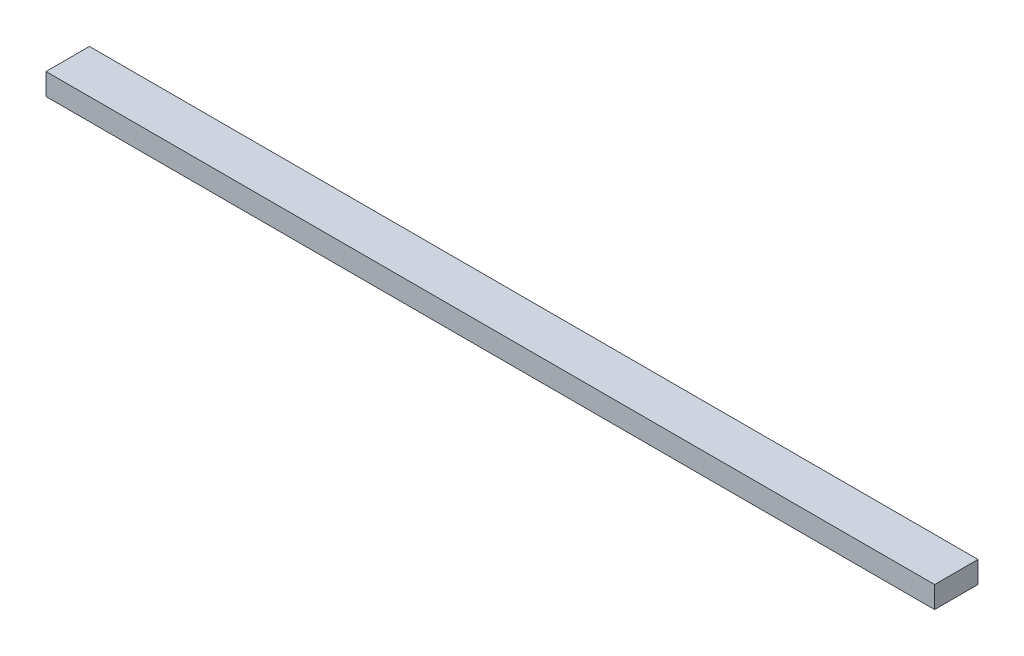
ISO-10303-21;
HEADER;
FILE_DESCRIPTION(('STEP AP214'),'2;1');
FILE_NAME('part.step','',(''),(''),'','','');
FILE_SCHEMA(('AUTOMOTIVE_DESIGN { 1 0 10303 214 1 1 1 1 }'));
ENDSEC;
DATA;
#1=APPLICATION_CONTEXT('core data for automotive mechanical design processes');
#2=APPLICATION_PROTOCOL_DEFINITION('international standard','automotive_design',2000,#1);
#3=PRODUCT_CONTEXT('',#1,'mechanical');
#4=PRODUCT('Part','Part','',(#3));
#5=PRODUCT_RELATED_PRODUCT_CATEGORY('part','',(#4));
#6=PRODUCT_DEFINITION_FORMATION('','',#4);
#7=PRODUCT_DEFINITION_CONTEXT('part definition',#1,'design');
#8=PRODUCT_DEFINITION('design','',#6,#7);
#9=PRODUCT_DEFINITION_SHAPE('','',#8);
#10=(LENGTH_UNIT() NAMED_UNIT(*) SI_UNIT(.MILLI.,.METRE.));
#11=(NAMED_UNIT(*) PLANE_ANGLE_UNIT() SI_UNIT($,.RADIAN.));
#12=(NAMED_UNIT(*) SI_UNIT($,.STERADIAN.) SOLID_ANGLE_UNIT());
#13=UNCERTAINTY_MEASURE_WITH_UNIT(LENGTH_MEASURE(1.E-05),#10,'distance_accuracy_value','');
#14=(GEOMETRIC_REPRESENTATION_CONTEXT(3) GLOBAL_UNCERTAINTY_ASSIGNED_CONTEXT((#13)) GLOBAL_UNIT_ASSIGNED_CONTEXT((#10,
#11,#12)) REPRESENTATION_CONTEXT('',''));
#15=CARTESIAN_POINT('',(0.,0.,0.));
#16=DIRECTION('',(0.,0.,1.));
#17=DIRECTION('',(1.,0.,0.));
#18=AXIS2_PLACEMENT_3D('',#15,#16,#17);
#19=CARTESIAN_POINT('',(64.9999999999999,-1.5875,3.175));
#20=DIRECTION('',(0.,1.,0.));
#21=DIRECTION('',(0.,0.,1.));
#22=AXIS2_PLACEMENT_3D('',#19,#20,#21);
#23=PLANE('',#22);
#24=DIRECTION('',(-1.,0.,0.));
#25=VECTOR('',#24,1.);
#26=CARTESIAN_POINT('',(64.9999999999999,-1.5875,3.175));
#27=LINE('',#26,#25);
#28=CARTESIAN_POINT('',(64.9999999999999,-1.5875,3.175));
#29=VERTEX_POINT('',#28);
#30=CARTESIAN_POINT('',(-64.9999999999999,-1.5875,3.175));
#31=VERTEX_POINT('',#30);
#32=EDGE_CURVE('E98',#29,#31,#27,.T.);
#33=ORIENTED_EDGE('',*,*,#32,.T.);
#34=DIRECTION('',(0.,0.,-1.));
#35=VECTOR('',#34,1.);
#36=CARTESIAN_POINT('',(-64.9999999999999,-1.5875,3.175));
#37=LINE('',#36,#35);
#38=CARTESIAN_POINT('',(-64.9999999999999,-1.5875,-3.175));
#39=VERTEX_POINT('',#38);
#40=EDGE_CURVE('E93',#31,#39,#37,.T.);
#41=ORIENTED_EDGE('',*,*,#40,.T.);
#42=DIRECTION('',(-1.,0.,0.));
#43=VECTOR('',#42,1.);
#44=CARTESIAN_POINT('',(64.9999999999999,-1.5875,-3.175));
#45=LINE('',#44,#43);
#46=CARTESIAN_POINT('',(64.9999999999999,-1.5875,-3.175));
#47=VERTEX_POINT('',#46);
#48=EDGE_CURVE('E11',#47,#39,#45,.T.);
#49=ORIENTED_EDGE('',*,*,#48,.F.);
#50=DIRECTION('',(0.,0.,-1.));
#51=VECTOR('',#50,1.);
#52=CARTESIAN_POINT('',(64.9999999999999,-1.5875,3.175));
#53=LINE('',#52,#51);
#54=EDGE_CURVE('E104',#29,#47,#53,.T.);
#55=ORIENTED_EDGE('',*,*,#54,.F.);
#56=EDGE_LOOP('',(#33,#41,#49,#55));
#57=FACE_BOUND('',#56,.T.);
#58=ADVANCED_FACE('F41',(#57),#23,.F.);
#59=CARTESIAN_POINT('',(64.9999999999999,-1.5875,-3.175));
#60=DIRECTION('',(0.,0.,1.));
#61=DIRECTION('',(1.,0.,0.));
#62=AXIS2_PLACEMENT_3D('',#59,#60,#61);
#63=PLANE('',#62);
#64=ORIENTED_EDGE('',*,*,#48,.T.);
#65=DIRECTION('',(0.,1.,0.));
#66=VECTOR('',#65,1.);
#67=CARTESIAN_POINT('',(-64.9999999999999,-1.5875,-3.175));
#68=LINE('',#67,#66);
#69=CARTESIAN_POINT('',(-64.9999999999999,1.5875,-3.175));
#70=VERTEX_POINT('',#69);
#71=EDGE_CURVE('E83',#39,#70,#68,.T.);
#72=ORIENTED_EDGE('',*,*,#71,.T.);
#73=DIRECTION('',(-1.,0.,0.));
#74=VECTOR('',#73,1.);
#75=CARTESIAN_POINT('',(64.9999999999999,1.5875,-3.175));
#76=LINE('',#75,#74);
#77=CARTESIAN_POINT('',(64.9999999999999,1.5875,-3.175));
#78=VERTEX_POINT('',#77);
#79=EDGE_CURVE('E48',#78,#70,#76,.T.);
#80=ORIENTED_EDGE('',*,*,#79,.F.);
#81=DIRECTION('',(0.,1.,0.));
#82=VECTOR('',#81,1.);
#83=CARTESIAN_POINT('',(64.9999999999999,-1.5875,-3.175));
#84=LINE('',#83,#82);
#85=EDGE_CURVE('E84',#47,#78,#84,.T.);
#86=ORIENTED_EDGE('',*,*,#85,.F.);
#87=EDGE_LOOP('',(#64,#72,#80,#86));
#88=FACE_BOUND('',#87,.T.);
#89=ADVANCED_FACE('F81',(#88),#63,.F.);
#90=CARTESIAN_POINT('',(64.9999999999999,1.5875,3.175));
#91=DIRECTION('',(0.,-1.,0.));
#92=DIRECTION('',(0.,0.,-1.));
#93=AXIS2_PLACEMENT_3D('',#90,#91,#92);
#94=PLANE('',#93);
#95=ORIENTED_EDGE('',*,*,#79,.T.);
#96=DIRECTION('',(0.,0.,1.));
#97=VECTOR('',#96,1.);
#98=CARTESIAN_POINT('',(-64.9999999999999,1.5875,3.175));
#99=LINE('',#98,#97);
#100=CARTESIAN_POINT('',(-64.9999999999999,1.5875,3.175));
#101=VERTEX_POINT('',#100);
#102=EDGE_CURVE('E96',#70,#101,#99,.T.);
#103=ORIENTED_EDGE('',*,*,#102,.T.);
#104=DIRECTION('',(-1.,0.,0.));
#105=VECTOR('',#104,1.);
#106=CARTESIAN_POINT('',(64.9999999999999,1.5875,3.175));
#107=LINE('',#106,#105);
#108=CARTESIAN_POINT('',(64.9999999999999,1.5875,3.175));
#109=VERTEX_POINT('',#108);
#110=EDGE_CURVE('E110',#109,#101,#107,.T.);
#111=ORIENTED_EDGE('',*,*,#110,.F.);
#112=DIRECTION('',(0.,0.,1.));
#113=VECTOR('',#112,1.);
#114=CARTESIAN_POINT('',(64.9999999999999,1.5875,3.175));
#115=LINE('',#114,#113);
#116=EDGE_CURVE('E60',#78,#109,#115,.T.);
#117=ORIENTED_EDGE('',*,*,#116,.F.);
#118=EDGE_LOOP('',(#95,#103,#111,#117));
#119=FACE_BOUND('',#118,.T.);
#120=ADVANCED_FACE('F112',(#119),#94,.F.);
#121=CARTESIAN_POINT('',(64.9999999999999,-1.5875,3.175));
#122=DIRECTION('',(0.,0.,-1.));
#123=DIRECTION('',(-1.,0.,0.));
#124=AXIS2_PLACEMENT_3D('',#121,#122,#123);
#125=PLANE('',#124);
#126=ORIENTED_EDGE('',*,*,#110,.T.);
#127=DIRECTION('',(0.,-1.,0.));
#128=VECTOR('',#127,1.);
#129=CARTESIAN_POINT('',(-64.9999999999999,-1.5875,3.175));
#130=LINE('',#129,#128);
#131=EDGE_CURVE('E102',#101,#31,#130,.T.);
#132=ORIENTED_EDGE('',*,*,#131,.T.);
#133=ORIENTED_EDGE('',*,*,#32,.F.);
#134=DIRECTION('',(0.,-1.,0.));
#135=VECTOR('',#134,1.);
#136=CARTESIAN_POINT('',(64.9999999999999,-1.5875,3.175));
#137=LINE('',#136,#135);
#138=EDGE_CURVE('E55',#109,#29,#137,.T.);
#139=ORIENTED_EDGE('',*,*,#138,.F.);
#140=EDGE_LOOP('',(#126,#132,#133,#139));
#141=FACE_BOUND('',#140,.T.);
#142=ADVANCED_FACE('F114',(#141),#125,.F.);
#143=CARTESIAN_POINT('',(64.9999999999999,0.,0.));
#144=DIRECTION('',(1.,0.,0.));
#145=DIRECTION('',(0.,0.,-1.));
#146=AXIS2_PLACEMENT_3D('',#143,#144,#145);
#147=PLANE('',#146);
#148=ORIENTED_EDGE('',*,*,#54,.T.);
#149=ORIENTED_EDGE('',*,*,#85,.T.);
#150=ORIENTED_EDGE('',*,*,#116,.T.);
#151=ORIENTED_EDGE('',*,*,#138,.T.);
#152=EDGE_LOOP('',(#148,#149,#150,#151));
#153=FACE_BOUND('',#152,.T.);
#154=ADVANCED_FACE('F115',(#153),#147,.T.);
#155=CARTESIAN_POINT('',(-64.9999999999999,0.,0.));
#156=DIRECTION('',(1.,0.,0.));
#157=DIRECTION('',(0.,0.,-1.));
#158=AXIS2_PLACEMENT_3D('',#155,#156,#157);
#159=PLANE('',#158);
#160=ORIENTED_EDGE('',*,*,#40,.F.);
#161=ORIENTED_EDGE('',*,*,#131,.F.);
#162=ORIENTED_EDGE('',*,*,#102,.F.);
#163=ORIENTED_EDGE('',*,*,#71,.F.);
#164=EDGE_LOOP('',(#160,#161,#162,#163));
#165=FACE_BOUND('',#164,.T.);
#166=ADVANCED_FACE('F91',(#165),#159,.F.);
#167=CLOSED_SHELL('',(#58,#89,#120,#142,#154,#166));
#168=MANIFOLD_SOLID_BREP('B2',#167);
#169=ADVANCED_BREP_SHAPE_REPRESENTATION('',(#18,#168),#14);
#170=SHAPE_DEFINITION_REPRESENTATION(#9,#169);
ENDSEC;
END-ISO-10303-21;
